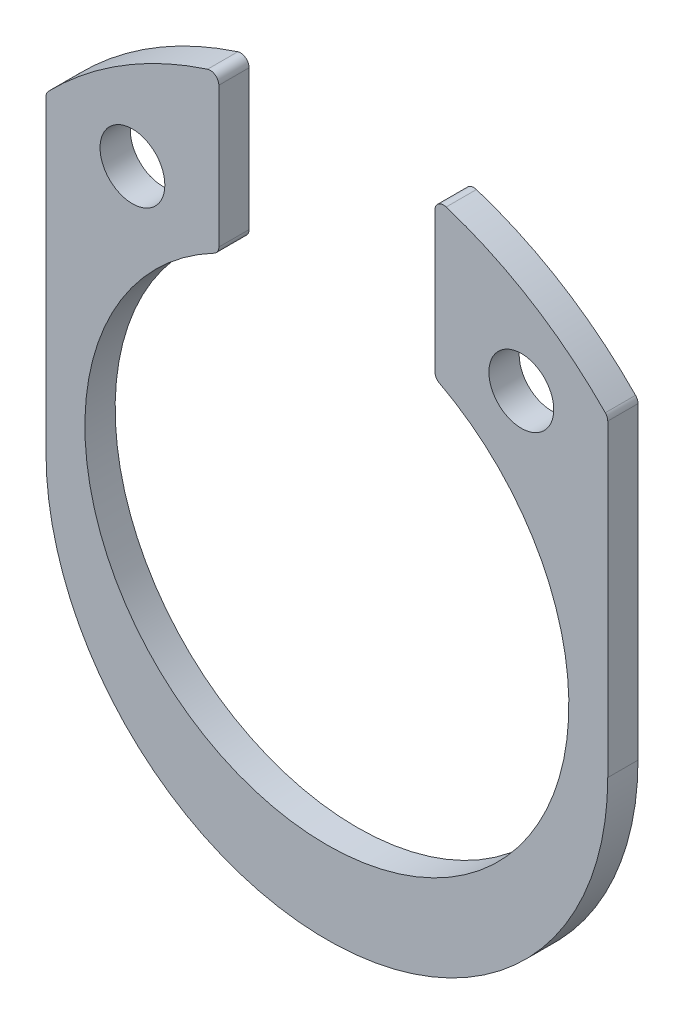
ISO-10303-21;
HEADER;
FILE_DESCRIPTION(('STEP AP214'),'2;1');
FILE_NAME('part.step','',(''),(''),'','','');
FILE_SCHEMA(('AUTOMOTIVE_DESIGN { 1 0 10303 214 1 1 1 1 }'));
ENDSEC;
DATA;
#1=APPLICATION_CONTEXT('core data for automotive mechanical design processes');
#2=APPLICATION_PROTOCOL_DEFINITION('international standard','automotive_design',2000,#1);
#3=PRODUCT_CONTEXT('',#1,'mechanical');
#4=PRODUCT('Part','Part','',(#3));
#5=PRODUCT_RELATED_PRODUCT_CATEGORY('part','',(#4));
#6=PRODUCT_DEFINITION_FORMATION('','',#4);
#7=PRODUCT_DEFINITION_CONTEXT('part definition',#1,'design');
#8=PRODUCT_DEFINITION('design','',#6,#7);
#9=PRODUCT_DEFINITION_SHAPE('','',#8);
#10=(LENGTH_UNIT() NAMED_UNIT(*) SI_UNIT(.MILLI.,.METRE.));
#11=(NAMED_UNIT(*) PLANE_ANGLE_UNIT() SI_UNIT($,.RADIAN.));
#12=(NAMED_UNIT(*) SI_UNIT($,.STERADIAN.) SOLID_ANGLE_UNIT());
#13=UNCERTAINTY_MEASURE_WITH_UNIT(LENGTH_MEASURE(1.E-05),#10,'distance_accuracy_value','');
#14=(GEOMETRIC_REPRESENTATION_CONTEXT(3) GLOBAL_UNCERTAINTY_ASSIGNED_CONTEXT((#13)) GLOBAL_UNIT_ASSIGNED_CONTEXT((#10,
#11,#12)) REPRESENTATION_CONTEXT('',''));
#15=CARTESIAN_POINT('',(0.,0.,0.));
#16=DIRECTION('',(0.,0.,1.));
#17=DIRECTION('',(1.,0.,0.));
#18=AXIS2_PLACEMENT_3D('',#15,#16,#17);
#19=CARTESIAN_POINT('',(-6.3,6.14410286372225,0.7));
#20=DIRECTION('',(0.,0.,1.));
#21=DIRECTION('',(1.,0.,0.));
#22=AXIS2_PLACEMENT_3D('',#19,#20,#21);
#23=PLANE('',#22);
#24=CARTESIAN_POINT('',(-4.5,5.75,0.7));
#25=DIRECTION('',(0.,0.,1.));
#26=DIRECTION('',(1.,0.,0.));
#27=AXIS2_PLACEMENT_3D('',#24,#25,#26);
#28=CIRCLE('',#27,0.749999999999999);
#29=CARTESIAN_POINT('',(-3.75,5.75,0.7));
#30=VERTEX_POINT('',#29);
#31=EDGE_CURVE('E470',#30,#30,#28,.T.);
#32=ORIENTED_EDGE('',*,*,#31,.F.);
#33=EDGE_LOOP('',(#32));
#34=FACE_BOUND('',#33,.T.);
#35=CARTESIAN_POINT('',(-6.3,6.14410286372225,0.7));
#36=DIRECTION('',(0.,0.,1.));
#37=DIRECTION('',(1.,0.,0.));
#38=AXIS2_PLACEMENT_3D('',#35,#36,#37);
#39=CIRCLE('',#38,0.2);
#40=CARTESIAN_POINT('',(-6.44318181818182,6.28374156517048,0.7));
#41=VERTEX_POINT('',#40);
#42=CARTESIAN_POINT('',(-6.5,6.14410286372225,0.7));
#43=VERTEX_POINT('',#42);
#44=EDGE_CURVE('E500',#41,#43,#39,.T.);
#45=ORIENTED_EDGE('',*,*,#44,.T.);
#46=DIRECTION('',(0.,-1.,0.));
#47=VECTOR('',#46,1.);
#48=CARTESIAN_POINT('',(-6.5,-1.,0.7));
#49=LINE('',#48,#47);
#50=CARTESIAN_POINT('',(-6.5,-0.999999999999999,0.7));
#51=VERTEX_POINT('',#50);
#52=EDGE_CURVE('E465',#43,#51,#49,.T.);
#53=ORIENTED_EDGE('',*,*,#52,.T.);
#54=CARTESIAN_POINT('',(0.,-1.,0.7));
#55=DIRECTION('',(0.,0.,1.));
#56=DIRECTION('',(1.,0.,0.));
#57=AXIS2_PLACEMENT_3D('',#54,#55,#56);
#58=CIRCLE('',#57,6.5);
#59=CARTESIAN_POINT('',(6.5,-1.,0.7));
#60=VERTEX_POINT('',#59);
#61=EDGE_CURVE('E503',#51,#60,#58,.T.);
#62=ORIENTED_EDGE('',*,*,#61,.T.);
#63=DIRECTION('',(0.,1.,0.));
#64=VECTOR('',#63,1.);
#65=CARTESIAN_POINT('',(6.5,-1.,0.7));
#66=LINE('',#65,#64);
#67=CARTESIAN_POINT('',(6.5,6.14410286372225,0.7));
#68=VERTEX_POINT('',#67);
#69=EDGE_CURVE('E505',#60,#68,#66,.T.);
#70=ORIENTED_EDGE('',*,*,#69,.T.);
#71=CARTESIAN_POINT('',(6.3,6.14410286372225,0.7));
#72=DIRECTION('',(0.,0.,1.));
#73=DIRECTION('',(-1.,0.,0.));
#74=AXIS2_PLACEMENT_3D('',#71,#72,#73);
#75=CIRCLE('',#74,0.2);
#76=CARTESIAN_POINT('',(6.44318181818182,6.28374156517048,0.7));
#77=VERTEX_POINT('',#76);
#78=EDGE_CURVE('E507',#68,#77,#75,.T.);
#79=ORIENTED_EDGE('',*,*,#78,.T.);
#80=CARTESIAN_POINT('',(0.,0.,0.7));
#81=DIRECTION('',(0.,0.,1.));
#82=DIRECTION('',(-1.,0.,0.));
#83=AXIS2_PLACEMENT_3D('',#80,#81,#82);
#84=CIRCLE('',#83,9.);
#85=CARTESIAN_POINT('',(2.76136363636364,8.5659133119457,0.7));
#86=VERTEX_POINT('',#85);
#87=EDGE_CURVE('E509',#77,#86,#84,.T.);
#88=ORIENTED_EDGE('',*,*,#87,.T.);
#89=CARTESIAN_POINT('',(2.7,8.37555968279135,0.7));
#90=DIRECTION('',(0.,0.,1.));
#91=DIRECTION('',(-1.,0.,0.));
#92=AXIS2_PLACEMENT_3D('',#89,#90,#91);
#93=CIRCLE('',#92,0.200000000000001);
#94=CARTESIAN_POINT('',(2.5,8.37555968279135,0.7));
#95=VERTEX_POINT('',#94);
#96=EDGE_CURVE('E511',#86,#95,#93,.T.);
#97=ORIENTED_EDGE('',*,*,#96,.T.);
#98=DIRECTION('',(0.,-1.,0.));
#99=VECTOR('',#98,1.);
#100=CARTESIAN_POINT('',(2.5,5.13322510708424,0.7));
#101=LINE('',#100,#99);
#102=CARTESIAN_POINT('',(2.5,5.13322510708424,0.7));
#103=VERTEX_POINT('',#102);
#104=EDGE_CURVE('E513',#95,#103,#101,.T.);
#105=ORIENTED_EDGE('',*,*,#104,.T.);
#106=CARTESIAN_POINT('',(2.7,5.13322510708424,0.7));
#107=DIRECTION('',(0.,0.,1.));
#108=DIRECTION('',(1.,0.,0.));
#109=AXIS2_PLACEMENT_3D('',#106,#107,#108);
#110=CIRCLE('',#109,0.2);
#111=CARTESIAN_POINT('',(2.60689655172414,4.95621734477099,0.7));
#112=VERTEX_POINT('',#111);
#113=EDGE_CURVE('E515',#103,#112,#110,.T.);
#114=ORIENTED_EDGE('',*,*,#113,.T.);
#115=CARTESIAN_POINT('',(0.,0.,0.7));
#116=DIRECTION('',(0.,0.,-1.));
#117=DIRECTION('',(1.,0.,0.));
#118=AXIS2_PLACEMENT_3D('',#115,#116,#117);
#119=CIRCLE('',#118,5.6);
#120=CARTESIAN_POINT('',(-2.60689655172414,4.95621734477099,0.7));
#121=VERTEX_POINT('',#120);
#122=EDGE_CURVE('E517',#112,#121,#119,.T.);
#123=ORIENTED_EDGE('',*,*,#122,.T.);
#124=CARTESIAN_POINT('',(-2.7,5.13322510708424,0.7));
#125=DIRECTION('',(0.,0.,1.));
#126=DIRECTION('',(-1.,0.,0.));
#127=AXIS2_PLACEMENT_3D('',#124,#125,#126);
#128=CIRCLE('',#127,0.2);
#129=CARTESIAN_POINT('',(-2.5,5.13322510708424,0.7));
#130=VERTEX_POINT('',#129);
#131=EDGE_CURVE('E519',#121,#130,#128,.T.);
#132=ORIENTED_EDGE('',*,*,#131,.T.);
#133=DIRECTION('',(0.,1.,0.));
#134=VECTOR('',#133,1.);
#135=CARTESIAN_POINT('',(-2.5,5.13322510708424,0.7));
#136=LINE('',#135,#134);
#137=CARTESIAN_POINT('',(-2.5,8.37555968279135,0.7));
#138=VERTEX_POINT('',#137);
#139=EDGE_CURVE('E521',#130,#138,#136,.T.);
#140=ORIENTED_EDGE('',*,*,#139,.T.);
#141=CARTESIAN_POINT('',(-2.7,8.37555968279135,0.7));
#142=DIRECTION('',(0.,0.,1.));
#143=DIRECTION('',(1.,0.,0.));
#144=AXIS2_PLACEMENT_3D('',#141,#142,#143);
#145=CIRCLE('',#144,0.200000000000001);
#146=CARTESIAN_POINT('',(-2.76136363636364,8.5659133119457,0.7));
#147=VERTEX_POINT('',#146);
#148=EDGE_CURVE('E370',#138,#147,#145,.T.);
#149=ORIENTED_EDGE('',*,*,#148,.T.);
#150=CARTESIAN_POINT('',(0.,0.,0.7));
#151=DIRECTION('',(0.,0.,1.));
#152=DIRECTION('',(1.,0.,0.));
#153=AXIS2_PLACEMENT_3D('',#150,#151,#152);
#154=CIRCLE('',#153,9.);
#155=EDGE_CURVE('E365',#147,#41,#154,.T.);
#156=ORIENTED_EDGE('',*,*,#155,.T.);
#157=EDGE_LOOP('',(#45,#53,#62,#70,#79,#88,#97,#105,#114,#123,#132,#140,#149,#156));
#158=FACE_BOUND('',#157,.T.);
#159=CARTESIAN_POINT('',(4.5,5.75,0.7));
#160=DIRECTION('',(0.,0.,1.));
#161=DIRECTION('',(-1.,0.,0.));
#162=AXIS2_PLACEMENT_3D('',#159,#160,#161);
#163=CIRCLE('',#162,0.749999999999999);
#164=CARTESIAN_POINT('',(3.75,5.75,0.7));
#165=VERTEX_POINT('',#164);
#166=EDGE_CURVE('E640',#165,#165,#163,.T.);
#167=ORIENTED_EDGE('',*,*,#166,.F.);
#168=EDGE_LOOP('',(#167));
#169=FACE_BOUND('',#168,.T.);
#170=ADVANCED_FACE('F350',(#34,#158,#169),#23,.T.);
#171=CARTESIAN_POINT('',(-6.3,6.14410286372225,0.));
#172=DIRECTION('',(0.,0.,1.));
#173=DIRECTION('',(1.,0.,0.));
#174=AXIS2_PLACEMENT_3D('',#171,#172,#173);
#175=PLANE('',#174);
#176=CARTESIAN_POINT('',(-4.5,5.75,0.));
#177=DIRECTION('',(0.,0.,1.));
#178=DIRECTION('',(1.,0.,0.));
#179=AXIS2_PLACEMENT_3D('',#176,#177,#178);
#180=CIRCLE('',#179,0.749999999999999);
#181=CARTESIAN_POINT('',(-3.75,5.75,0.));
#182=VERTEX_POINT('',#181);
#183=EDGE_CURVE('E473',#182,#182,#180,.T.);
#184=ORIENTED_EDGE('',*,*,#183,.T.);
#185=EDGE_LOOP('',(#184));
#186=FACE_BOUND('',#185,.T.);
#187=CARTESIAN_POINT('',(-6.3,6.14410286372225,0.));
#188=DIRECTION('',(0.,0.,1.));
#189=DIRECTION('',(1.,0.,0.));
#190=AXIS2_PLACEMENT_3D('',#187,#188,#189);
#191=CIRCLE('',#190,0.2);
#192=CARTESIAN_POINT('',(-6.44318181818182,6.28374156517048,0.));
#193=VERTEX_POINT('',#192);
#194=CARTESIAN_POINT('',(-6.5,6.14410286372225,0.));
#195=VERTEX_POINT('',#194);
#196=EDGE_CURVE('E456',#193,#195,#191,.T.);
#197=ORIENTED_EDGE('',*,*,#196,.F.);
#198=CARTESIAN_POINT('',(0.,0.,0.));
#199=DIRECTION('',(0.,0.,1.));
#200=DIRECTION('',(1.,0.,0.));
#201=AXIS2_PLACEMENT_3D('',#198,#199,#200);
#202=CIRCLE('',#201,9.);
#203=CARTESIAN_POINT('',(-2.76136363636364,8.5659133119457,0.));
#204=VERTEX_POINT('',#203);
#205=EDGE_CURVE('E498',#204,#193,#202,.T.);
#206=ORIENTED_EDGE('',*,*,#205,.F.);
#207=CARTESIAN_POINT('',(-2.7,8.37555968279135,0.));
#208=DIRECTION('',(0.,0.,1.));
#209=DIRECTION('',(1.,0.,0.));
#210=AXIS2_PLACEMENT_3D('',#207,#208,#209);
#211=CIRCLE('',#210,0.200000000000001);
#212=CARTESIAN_POINT('',(-2.5,8.37555968279135,0.));
#213=VERTEX_POINT('',#212);
#214=EDGE_CURVE('E496',#213,#204,#211,.T.);
#215=ORIENTED_EDGE('',*,*,#214,.F.);
#216=DIRECTION('',(0.,1.,0.));
#217=VECTOR('',#216,1.);
#218=CARTESIAN_POINT('',(-2.5,5.13322510708424,0.));
#219=LINE('',#218,#217);
#220=CARTESIAN_POINT('',(-2.5,5.13322510708424,0.));
#221=VERTEX_POINT('',#220);
#222=EDGE_CURVE('E494',#221,#213,#219,.T.);
#223=ORIENTED_EDGE('',*,*,#222,.F.);
#224=CARTESIAN_POINT('',(-2.7,5.13322510708424,0.));
#225=DIRECTION('',(0.,0.,1.));
#226=DIRECTION('',(-1.,0.,0.));
#227=AXIS2_PLACEMENT_3D('',#224,#225,#226);
#228=CIRCLE('',#227,0.2);
#229=CARTESIAN_POINT('',(-2.60689655172414,4.95621734477099,0.));
#230=VERTEX_POINT('',#229);
#231=EDGE_CURVE('E492',#230,#221,#228,.T.);
#232=ORIENTED_EDGE('',*,*,#231,.F.);
#233=CARTESIAN_POINT('',(0.,0.,0.));
#234=DIRECTION('',(0.,0.,-1.));
#235=DIRECTION('',(1.,0.,0.));
#236=AXIS2_PLACEMENT_3D('',#233,#234,#235);
#237=CIRCLE('',#236,5.6);
#238=CARTESIAN_POINT('',(2.60689655172414,4.95621734477099,0.));
#239=VERTEX_POINT('',#238);
#240=EDGE_CURVE('E490',#239,#230,#237,.T.);
#241=ORIENTED_EDGE('',*,*,#240,.F.);
#242=CARTESIAN_POINT('',(2.7,5.13322510708424,0.));
#243=DIRECTION('',(0.,0.,1.));
#244=DIRECTION('',(1.,0.,0.));
#245=AXIS2_PLACEMENT_3D('',#242,#243,#244);
#246=CIRCLE('',#245,0.2);
#247=CARTESIAN_POINT('',(2.5,5.13322510708424,0.));
#248=VERTEX_POINT('',#247);
#249=EDGE_CURVE('E488',#248,#239,#246,.T.);
#250=ORIENTED_EDGE('',*,*,#249,.F.);
#251=DIRECTION('',(0.,-1.,0.));
#252=VECTOR('',#251,1.);
#253=CARTESIAN_POINT('',(2.5,5.13322510708424,0.));
#254=LINE('',#253,#252);
#255=CARTESIAN_POINT('',(2.5,8.37555968279135,0.));
#256=VERTEX_POINT('',#255);
#257=EDGE_CURVE('E486',#256,#248,#254,.T.);
#258=ORIENTED_EDGE('',*,*,#257,.F.);
#259=CARTESIAN_POINT('',(2.7,8.37555968279135,0.));
#260=DIRECTION('',(0.,0.,1.));
#261=DIRECTION('',(-1.,0.,0.));
#262=AXIS2_PLACEMENT_3D('',#259,#260,#261);
#263=CIRCLE('',#262,0.200000000000001);
#264=CARTESIAN_POINT('',(2.76136363636364,8.5659133119457,0.));
#265=VERTEX_POINT('',#264);
#266=EDGE_CURVE('E484',#265,#256,#263,.T.);
#267=ORIENTED_EDGE('',*,*,#266,.F.);
#268=CARTESIAN_POINT('',(0.,0.,0.));
#269=DIRECTION('',(0.,0.,1.));
#270=DIRECTION('',(-1.,0.,0.));
#271=AXIS2_PLACEMENT_3D('',#268,#269,#270);
#272=CIRCLE('',#271,9.);
#273=CARTESIAN_POINT('',(6.44318181818182,6.28374156517048,0.));
#274=VERTEX_POINT('',#273);
#275=EDGE_CURVE('E482',#274,#265,#272,.T.);
#276=ORIENTED_EDGE('',*,*,#275,.F.);
#277=CARTESIAN_POINT('',(6.3,6.14410286372225,0.));
#278=DIRECTION('',(0.,0.,1.));
#279=DIRECTION('',(-1.,0.,0.));
#280=AXIS2_PLACEMENT_3D('',#277,#278,#279);
#281=CIRCLE('',#280,0.2);
#282=CARTESIAN_POINT('',(6.5,6.14410286372225,0.));
#283=VERTEX_POINT('',#282);
#284=EDGE_CURVE('E480',#283,#274,#281,.T.);
#285=ORIENTED_EDGE('',*,*,#284,.F.);
#286=DIRECTION('',(0.,1.,0.));
#287=VECTOR('',#286,1.);
#288=CARTESIAN_POINT('',(6.5,-1.,0.));
#289=LINE('',#288,#287);
#290=CARTESIAN_POINT('',(6.5,-1.,0.));
#291=VERTEX_POINT('',#290);
#292=EDGE_CURVE('E478',#291,#283,#289,.T.);
#293=ORIENTED_EDGE('',*,*,#292,.F.);
#294=CARTESIAN_POINT('',(0.,-1.,0.));
#295=DIRECTION('',(0.,0.,1.));
#296=DIRECTION('',(1.,0.,0.));
#297=AXIS2_PLACEMENT_3D('',#294,#295,#296);
#298=CIRCLE('',#297,6.5);
#299=CARTESIAN_POINT('',(-6.5,-0.999999999999999,0.));
#300=VERTEX_POINT('',#299);
#301=EDGE_CURVE('E458',#300,#291,#298,.T.);
#302=ORIENTED_EDGE('',*,*,#301,.F.);
#303=DIRECTION('',(0.,-1.,0.));
#304=VECTOR('',#303,1.);
#305=CARTESIAN_POINT('',(-6.5,-1.,0.));
#306=LINE('',#305,#304);
#307=EDGE_CURVE('E451',#195,#300,#306,.T.);
#308=ORIENTED_EDGE('',*,*,#307,.F.);
#309=EDGE_LOOP('',(#197,#206,#215,#223,#232,#241,#250,#258,#267,#276,#285,#293,#302,#308));
#310=FACE_BOUND('',#309,.T.);
#311=CARTESIAN_POINT('',(4.5,5.75,0.));
#312=DIRECTION('',(0.,0.,1.));
#313=DIRECTION('',(-1.,0.,0.));
#314=AXIS2_PLACEMENT_3D('',#311,#312,#313);
#315=CIRCLE('',#314,0.749999999999999);
#316=CARTESIAN_POINT('',(3.75,5.75,0.));
#317=VERTEX_POINT('',#316);
#318=EDGE_CURVE('E643',#317,#317,#315,.T.);
#319=ORIENTED_EDGE('',*,*,#318,.T.);
#320=EDGE_LOOP('',(#319));
#321=FACE_BOUND('',#320,.T.);
#322=ADVANCED_FACE('F452',(#186,#310,#321),#175,.F.);
#323=CARTESIAN_POINT('',(-6.3,6.14410286372225,0.7));
#324=DIRECTION('',(0.,0.,-1.));
#325=DIRECTION('',(-1.,0.,0.));
#326=AXIS2_PLACEMENT_3D('',#323,#324,#325);
#327=CYLINDRICAL_SURFACE('',#326,0.2);
#328=ORIENTED_EDGE('',*,*,#196,.T.);
#329=DIRECTION('',(0.,0.,-1.));
#330=VECTOR('',#329,1.);
#331=CARTESIAN_POINT('',(-6.5,6.14410286372225,0.7));
#332=LINE('',#331,#330);
#333=EDGE_CURVE('E11',#43,#195,#332,.T.);
#334=ORIENTED_EDGE('',*,*,#333,.F.);
#335=ORIENTED_EDGE('',*,*,#44,.F.);
#336=DIRECTION('',(0.,0.,-1.));
#337=VECTOR('',#336,1.);
#338=CARTESIAN_POINT('',(-6.44318181818182,6.28374156517048,0.7));
#339=LINE('',#338,#337);
#340=EDGE_CURVE('E469',#41,#193,#339,.T.);
#341=ORIENTED_EDGE('',*,*,#340,.T.);
#342=EDGE_LOOP('',(#328,#334,#335,#341));
#343=FACE_BOUND('',#342,.T.);
#344=ADVANCED_FACE('F352',(#343),#327,.T.);
#345=CARTESIAN_POINT('',(-6.5,-1.,0.7));
#346=DIRECTION('',(1.,0.,0.));
#347=DIRECTION('',(0.,1.,0.));
#348=AXIS2_PLACEMENT_3D('',#345,#346,#347);
#349=PLANE('',#348);
#350=ORIENTED_EDGE('',*,*,#307,.T.);
#351=DIRECTION('',(0.,0.,-1.));
#352=VECTOR('',#351,1.);
#353=CARTESIAN_POINT('',(-6.5,-0.999999999999999,0.7));
#354=LINE('',#353,#352);
#355=EDGE_CURVE('E358',#51,#300,#354,.T.);
#356=ORIENTED_EDGE('',*,*,#355,.F.);
#357=ORIENTED_EDGE('',*,*,#52,.F.);
#358=ORIENTED_EDGE('',*,*,#333,.T.);
#359=EDGE_LOOP('',(#350,#356,#357,#358));
#360=FACE_BOUND('',#359,.T.);
#361=ADVANCED_FACE('F464',(#360),#349,.F.);
#362=CARTESIAN_POINT('',(0.,-1.,0.7));
#363=DIRECTION('',(0.,0.,-1.));
#364=DIRECTION('',(-1.,0.,0.));
#365=AXIS2_PLACEMENT_3D('',#362,#363,#364);
#366=CYLINDRICAL_SURFACE('',#365,6.5);
#367=ORIENTED_EDGE('',*,*,#301,.T.);
#368=DIRECTION('',(0.,0.,-1.));
#369=VECTOR('',#368,1.);
#370=CARTESIAN_POINT('',(6.5,-1.,0.7));
#371=LINE('',#370,#369);
#372=EDGE_CURVE('E556',#60,#291,#371,.T.);
#373=ORIENTED_EDGE('',*,*,#372,.F.);
#374=ORIENTED_EDGE('',*,*,#61,.F.);
#375=ORIENTED_EDGE('',*,*,#355,.T.);
#376=EDGE_LOOP('',(#367,#373,#374,#375));
#377=FACE_BOUND('',#376,.T.);
#378=ADVANCED_FACE('F560',(#377),#366,.T.);
#379=CARTESIAN_POINT('',(6.5,-1.,0.7));
#380=DIRECTION('',(-1.,0.,0.));
#381=DIRECTION('',(0.,-1.,0.));
#382=AXIS2_PLACEMENT_3D('',#379,#380,#381);
#383=PLANE('',#382);
#384=ORIENTED_EDGE('',*,*,#292,.T.);
#385=DIRECTION('',(0.,0.,-1.));
#386=VECTOR('',#385,1.);
#387=CARTESIAN_POINT('',(6.5,6.14410286372225,0.7));
#388=LINE('',#387,#386);
#389=EDGE_CURVE('E553',#68,#283,#388,.T.);
#390=ORIENTED_EDGE('',*,*,#389,.F.);
#391=ORIENTED_EDGE('',*,*,#69,.F.);
#392=ORIENTED_EDGE('',*,*,#372,.T.);
#393=EDGE_LOOP('',(#384,#390,#391,#392));
#394=FACE_BOUND('',#393,.T.);
#395=ADVANCED_FACE('F568',(#394),#383,.F.);
#396=CARTESIAN_POINT('',(6.3,6.14410286372225,0.7));
#397=DIRECTION('',(0.,0.,-1.));
#398=DIRECTION('',(-1.,0.,0.));
#399=AXIS2_PLACEMENT_3D('',#396,#397,#398);
#400=CYLINDRICAL_SURFACE('',#399,0.2);
#401=ORIENTED_EDGE('',*,*,#284,.T.);
#402=DIRECTION('',(0.,0.,-1.));
#403=VECTOR('',#402,1.);
#404=CARTESIAN_POINT('',(6.44318181818182,6.28374156517048,0.7));
#405=LINE('',#404,#403);
#406=EDGE_CURVE('E550',#77,#274,#405,.T.);
#407=ORIENTED_EDGE('',*,*,#406,.F.);
#408=ORIENTED_EDGE('',*,*,#78,.F.);
#409=ORIENTED_EDGE('',*,*,#389,.T.);
#410=EDGE_LOOP('',(#401,#407,#408,#409));
#411=FACE_BOUND('',#410,.T.);
#412=ADVANCED_FACE('F571',(#411),#400,.T.);
#413=CARTESIAN_POINT('',(0.,0.,0.7));
#414=DIRECTION('',(0.,0.,-1.));
#415=DIRECTION('',(-1.,0.,0.));
#416=AXIS2_PLACEMENT_3D('',#413,#414,#415);
#417=CYLINDRICAL_SURFACE('',#416,9.);
#418=ORIENTED_EDGE('',*,*,#275,.T.);
#419=DIRECTION('',(0.,0.,-1.));
#420=VECTOR('',#419,1.);
#421=CARTESIAN_POINT('',(2.76136363636364,8.5659133119457,0.7));
#422=LINE('',#421,#420);
#423=EDGE_CURVE('E547',#86,#265,#422,.T.);
#424=ORIENTED_EDGE('',*,*,#423,.F.);
#425=ORIENTED_EDGE('',*,*,#87,.F.);
#426=ORIENTED_EDGE('',*,*,#406,.T.);
#427=EDGE_LOOP('',(#418,#424,#425,#426));
#428=FACE_BOUND('',#427,.T.);
#429=ADVANCED_FACE('F576',(#428),#417,.T.);
#430=CARTESIAN_POINT('',(2.7,8.37555968279135,0.7));
#431=DIRECTION('',(0.,0.,-1.));
#432=DIRECTION('',(-1.,0.,0.));
#433=AXIS2_PLACEMENT_3D('',#430,#431,#432);
#434=CYLINDRICAL_SURFACE('',#433,0.200000000000001);
#435=ORIENTED_EDGE('',*,*,#266,.T.);
#436=DIRECTION('',(0.,0.,-1.));
#437=VECTOR('',#436,1.);
#438=CARTESIAN_POINT('',(2.5,8.37555968279135,0.7));
#439=LINE('',#438,#437);
#440=EDGE_CURVE('E544',#95,#256,#439,.T.);
#441=ORIENTED_EDGE('',*,*,#440,.F.);
#442=ORIENTED_EDGE('',*,*,#96,.F.);
#443=ORIENTED_EDGE('',*,*,#423,.T.);
#444=EDGE_LOOP('',(#435,#441,#442,#443));
#445=FACE_BOUND('',#444,.T.);
#446=ADVANCED_FACE('F582',(#445),#434,.T.);
#447=CARTESIAN_POINT('',(2.5,5.13322510708424,0.7));
#448=DIRECTION('',(1.,0.,0.));
#449=DIRECTION('',(0.,0.,-1.));
#450=AXIS2_PLACEMENT_3D('',#447,#448,#449);
#451=PLANE('',#450);
#452=ORIENTED_EDGE('',*,*,#257,.T.);
#453=DIRECTION('',(0.,0.,-1.));
#454=VECTOR('',#453,1.);
#455=CARTESIAN_POINT('',(2.5,5.13322510708424,0.7));
#456=LINE('',#455,#454);
#457=EDGE_CURVE('E541',#103,#248,#456,.T.);
#458=ORIENTED_EDGE('',*,*,#457,.F.);
#459=ORIENTED_EDGE('',*,*,#104,.F.);
#460=ORIENTED_EDGE('',*,*,#440,.T.);
#461=EDGE_LOOP('',(#452,#458,#459,#460));
#462=FACE_BOUND('',#461,.T.);
#463=ADVANCED_FACE('F586',(#462),#451,.F.);
#464=CARTESIAN_POINT('',(2.7,5.13322510708424,0.7));
#465=DIRECTION('',(0.,0.,-1.));
#466=DIRECTION('',(-1.,0.,0.));
#467=AXIS2_PLACEMENT_3D('',#464,#465,#466);
#468=CYLINDRICAL_SURFACE('',#467,0.2);
#469=ORIENTED_EDGE('',*,*,#249,.T.);
#470=DIRECTION('',(0.,0.,-1.));
#471=VECTOR('',#470,1.);
#472=CARTESIAN_POINT('',(2.60689655172414,4.95621734477099,0.7));
#473=LINE('',#472,#471);
#474=EDGE_CURVE('E538',#112,#239,#473,.T.);
#475=ORIENTED_EDGE('',*,*,#474,.F.);
#476=ORIENTED_EDGE('',*,*,#113,.F.);
#477=ORIENTED_EDGE('',*,*,#457,.T.);
#478=EDGE_LOOP('',(#469,#475,#476,#477));
#479=FACE_BOUND('',#478,.T.);
#480=ADVANCED_FACE('F591',(#479),#468,.T.);
#481=CARTESIAN_POINT('',(0.,0.,0.7));
#482=DIRECTION('',(0.,0.,-1.));
#483=DIRECTION('',(-1.,0.,0.));
#484=AXIS2_PLACEMENT_3D('',#481,#482,#483);
#485=CYLINDRICAL_SURFACE('',#484,5.6);
#486=ORIENTED_EDGE('',*,*,#240,.T.);
#487=DIRECTION('',(0.,0.,-1.));
#488=VECTOR('',#487,1.);
#489=CARTESIAN_POINT('',(-2.60689655172414,4.95621734477099,0.7));
#490=LINE('',#489,#488);
#491=EDGE_CURVE('E535',#121,#230,#490,.T.);
#492=ORIENTED_EDGE('',*,*,#491,.F.);
#493=ORIENTED_EDGE('',*,*,#122,.F.);
#494=ORIENTED_EDGE('',*,*,#474,.T.);
#495=EDGE_LOOP('',(#486,#492,#493,#494));
#496=FACE_BOUND('',#495,.T.);
#497=ADVANCED_FACE('F597',(#496),#485,.F.);
#498=CARTESIAN_POINT('',(-2.7,5.13322510708424,0.7));
#499=DIRECTION('',(0.,0.,-1.));
#500=DIRECTION('',(-1.,0.,0.));
#501=AXIS2_PLACEMENT_3D('',#498,#499,#500);
#502=CYLINDRICAL_SURFACE('',#501,0.2);
#503=ORIENTED_EDGE('',*,*,#231,.T.);
#504=DIRECTION('',(0.,0.,-1.));
#505=VECTOR('',#504,1.);
#506=CARTESIAN_POINT('',(-2.5,5.13322510708424,0.7));
#507=LINE('',#506,#505);
#508=EDGE_CURVE('E532',#130,#221,#507,.T.);
#509=ORIENTED_EDGE('',*,*,#508,.F.);
#510=ORIENTED_EDGE('',*,*,#131,.F.);
#511=ORIENTED_EDGE('',*,*,#491,.T.);
#512=EDGE_LOOP('',(#503,#509,#510,#511));
#513=FACE_BOUND('',#512,.T.);
#514=ADVANCED_FACE('F601',(#513),#502,.T.);
#515=CARTESIAN_POINT('',(-2.5,5.13322510708424,0.7));
#516=DIRECTION('',(-1.,0.,0.));
#517=DIRECTION('',(0.,0.,1.));
#518=AXIS2_PLACEMENT_3D('',#515,#516,#517);
#519=PLANE('',#518);
#520=ORIENTED_EDGE('',*,*,#222,.T.);
#521=DIRECTION('',(0.,0.,-1.));
#522=VECTOR('',#521,1.);
#523=CARTESIAN_POINT('',(-2.5,8.37555968279135,0.7));
#524=LINE('',#523,#522);
#525=EDGE_CURVE('E529',#138,#213,#524,.T.);
#526=ORIENTED_EDGE('',*,*,#525,.F.);
#527=ORIENTED_EDGE('',*,*,#139,.F.);
#528=ORIENTED_EDGE('',*,*,#508,.T.);
#529=EDGE_LOOP('',(#520,#526,#527,#528));
#530=FACE_BOUND('',#529,.T.);
#531=ADVANCED_FACE('F606',(#530),#519,.F.);
#532=CARTESIAN_POINT('',(-2.7,8.37555968279135,0.7));
#533=DIRECTION('',(0.,0.,-1.));
#534=DIRECTION('',(-1.,0.,0.));
#535=AXIS2_PLACEMENT_3D('',#532,#533,#534);
#536=CYLINDRICAL_SURFACE('',#535,0.200000000000001);
#537=ORIENTED_EDGE('',*,*,#214,.T.);
#538=DIRECTION('',(0.,0.,-1.));
#539=VECTOR('',#538,1.);
#540=CARTESIAN_POINT('',(-2.76136363636364,8.5659133119457,0.7));
#541=LINE('',#540,#539);
#542=EDGE_CURVE('E526',#147,#204,#541,.T.);
#543=ORIENTED_EDGE('',*,*,#542,.F.);
#544=ORIENTED_EDGE('',*,*,#148,.F.);
#545=ORIENTED_EDGE('',*,*,#525,.T.);
#546=EDGE_LOOP('',(#537,#543,#544,#545));
#547=FACE_BOUND('',#546,.T.);
#548=ADVANCED_FACE('F609',(#547),#536,.T.);
#549=CARTESIAN_POINT('',(0.,0.,0.7));
#550=DIRECTION('',(0.,0.,-1.));
#551=DIRECTION('',(-1.,0.,0.));
#552=AXIS2_PLACEMENT_3D('',#549,#550,#551);
#553=CYLINDRICAL_SURFACE('',#552,9.);
#554=ORIENTED_EDGE('',*,*,#205,.T.);
#555=ORIENTED_EDGE('',*,*,#340,.F.);
#556=ORIENTED_EDGE('',*,*,#155,.F.);
#557=ORIENTED_EDGE('',*,*,#542,.T.);
#558=EDGE_LOOP('',(#554,#555,#556,#557));
#559=FACE_BOUND('',#558,.T.);
#560=ADVANCED_FACE('F611',(#559),#553,.T.);
#561=CARTESIAN_POINT('',(-4.5,5.75,0.7));
#562=DIRECTION('',(0.,0.,-1.));
#563=DIRECTION('',(-1.,0.,0.));
#564=AXIS2_PLACEMENT_3D('',#561,#562,#563);
#565=CYLINDRICAL_SURFACE('',#564,0.749999999999999);
#566=ORIENTED_EDGE('',*,*,#31,.T.);
#567=EDGE_LOOP('',(#566));
#568=FACE_BOUND('',#567,.T.);
#569=ORIENTED_EDGE('',*,*,#183,.F.);
#570=EDGE_LOOP('',(#569));
#571=FACE_BOUND('',#570,.T.);
#572=ADVANCED_FACE('F613',(#568,#571),#565,.F.);
#573=CARTESIAN_POINT('',(4.5,5.75,0.7));
#574=DIRECTION('',(0.,0.,-1.));
#575=DIRECTION('',(-1.,0.,0.));
#576=AXIS2_PLACEMENT_3D('',#573,#574,#575);
#577=CYLINDRICAL_SURFACE('',#576,0.749999999999999);
#578=ORIENTED_EDGE('',*,*,#166,.T.);
#579=EDGE_LOOP('',(#578));
#580=FACE_BOUND('',#579,.T.);
#581=ORIENTED_EDGE('',*,*,#318,.F.);
#582=EDGE_LOOP('',(#581));
#583=FACE_BOUND('',#582,.T.);
#584=ADVANCED_FACE('F619',(#580,#583),#577,.F.);
#585=CLOSED_SHELL('',(#170,#322,#344,#361,#378,#395,#412,#429,#446,#463,#480,#497,#514,#531,
#548,#560,#572,#584));
#586=MANIFOLD_SOLID_BREP('B2',#585);
#587=ADVANCED_BREP_SHAPE_REPRESENTATION('',(#18,#586),#14);
#588=SHAPE_DEFINITION_REPRESENTATION(#9,#587);
ENDSEC;
END-ISO-10303-21;
